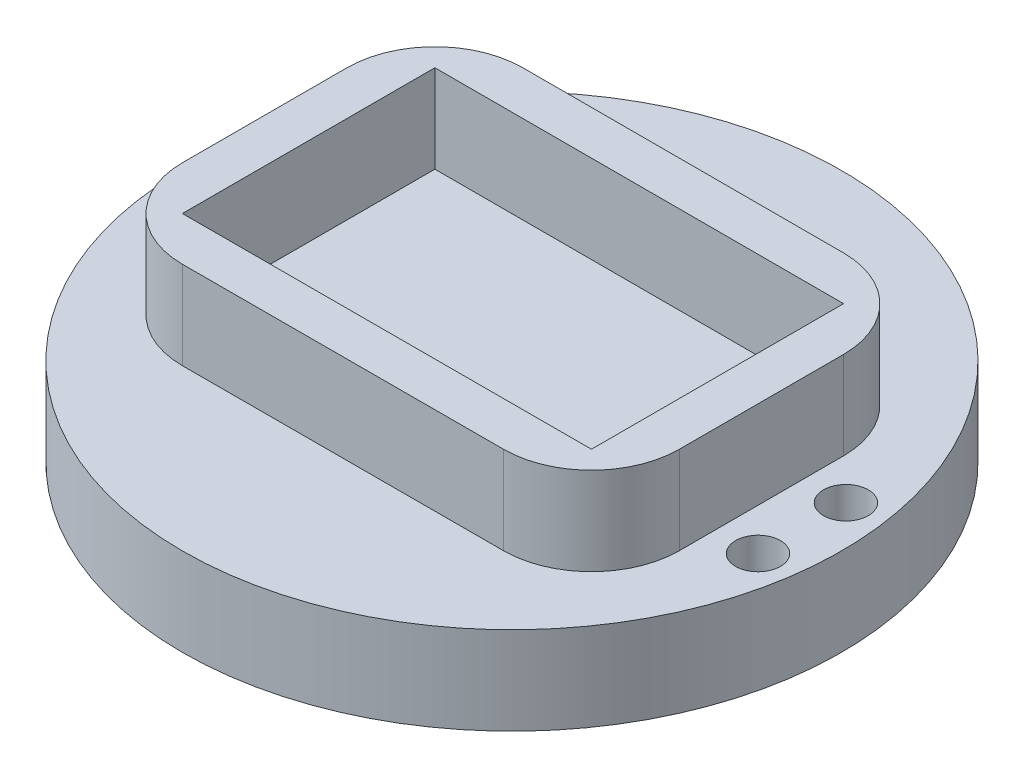
ISO-10303-21;
HEADER;
FILE_DESCRIPTION(('STEP AP214'),'2;1');
FILE_NAME('part.step','',(''),(''),'','','');
FILE_SCHEMA(('AUTOMOTIVE_DESIGN { 1 0 10303 214 1 1 1 1 }'));
ENDSEC;
DATA;
#1=APPLICATION_CONTEXT('core data for automotive mechanical design processes');
#2=APPLICATION_PROTOCOL_DEFINITION('international standard','automotive_design',2000,#1);
#3=PRODUCT_CONTEXT('',#1,'mechanical');
#4=PRODUCT('Part','Part','',(#3));
#5=PRODUCT_RELATED_PRODUCT_CATEGORY('part','',(#4));
#6=PRODUCT_DEFINITION_FORMATION('','',#4);
#7=PRODUCT_DEFINITION_CONTEXT('part definition',#1,'design');
#8=PRODUCT_DEFINITION('design','',#6,#7);
#9=PRODUCT_DEFINITION_SHAPE('','',#8);
#10=(LENGTH_UNIT() NAMED_UNIT(*) SI_UNIT(.MILLI.,.METRE.));
#11=(NAMED_UNIT(*) PLANE_ANGLE_UNIT() SI_UNIT($,.RADIAN.));
#12=(NAMED_UNIT(*) SI_UNIT($,.STERADIAN.) SOLID_ANGLE_UNIT());
#13=UNCERTAINTY_MEASURE_WITH_UNIT(LENGTH_MEASURE(1.E-05),#10,'distance_accuracy_value','');
#14=(GEOMETRIC_REPRESENTATION_CONTEXT(3) GLOBAL_UNCERTAINTY_ASSIGNED_CONTEXT((#13)) GLOBAL_UNIT_ASSIGNED_CONTEXT((#10,
#11,#12)) REPRESENTATION_CONTEXT('',''));
#15=CARTESIAN_POINT('',(0.,0.,0.));
#16=DIRECTION('',(0.,0.,1.));
#17=DIRECTION('',(1.,0.,0.));
#18=AXIS2_PLACEMENT_3D('',#15,#16,#17);
#19=CARTESIAN_POINT('',(11.9455168582029,10.,0.));
#20=DIRECTION('',(0.,-1.,0.));
#21=DIRECTION('',(0.,0.,-1.));
#22=AXIS2_PLACEMENT_3D('',#19,#20,#21);
#23=CYLINDRICAL_SURFACE('',#22,37.5);
#24=CARTESIAN_POINT('',(11.9455168582029,10.,0.));
#25=DIRECTION('',(0.,1.,0.));
#26=DIRECTION('',(0.,0.,1.));
#27=AXIS2_PLACEMENT_3D('',#24,#25,#26);
#28=CIRCLE('',#27,37.5);
#29=CARTESIAN_POINT('',(11.9455168582029,10.,37.5));
#30=VERTEX_POINT('',#29);
#31=EDGE_CURVE('E11',#30,#30,#28,.T.);
#32=ORIENTED_EDGE('',*,*,#31,.F.);
#33=EDGE_LOOP('',(#32));
#34=FACE_BOUND('',#33,.T.);
#35=CARTESIAN_POINT('',(11.9455168582029,0.,0.));
#36=DIRECTION('',(0.,1.,0.));
#37=DIRECTION('',(0.,0.,1.));
#38=AXIS2_PLACEMENT_3D('',#35,#36,#37);
#39=CIRCLE('',#38,37.5);
#40=CARTESIAN_POINT('',(11.9455168582029,0.,37.5));
#41=VERTEX_POINT('',#40);
#42=EDGE_CURVE('E48',#41,#41,#39,.T.);
#43=ORIENTED_EDGE('',*,*,#42,.T.);
#44=EDGE_LOOP('',(#43));
#45=FACE_BOUND('',#44,.T.);
#46=ADVANCED_FACE('F44',(#34,#45),#23,.T.);
#47=CARTESIAN_POINT('',(11.9455168582029,10.,0.));
#48=DIRECTION('',(0.,1.,0.));
#49=DIRECTION('',(0.,0.,1.));
#50=AXIS2_PLACEMENT_3D('',#47,#48,#49);
#51=PLANE('',#50);
#52=CARTESIAN_POINT('',(-21.0544831417971,10.,-5.));
#53=DIRECTION('',(0.,1.,0.));
#54=DIRECTION('',(0.,0.,-1.));
#55=AXIS2_PLACEMENT_3D('',#52,#53,#54);
#56=CIRCLE('',#55,2.55);
#57=CARTESIAN_POINT('',(-21.0544831417971,10.,-7.54999999999999));
#58=VERTEX_POINT('',#57);
#59=EDGE_CURVE('E488',#58,#58,#56,.T.);
#60=ORIENTED_EDGE('',*,*,#59,.F.);
#61=EDGE_LOOP('',(#60));
#62=FACE_BOUND('',#61,.T.);
#63=CARTESIAN_POINT('',(44.9455168582029,10.,5.));
#64=DIRECTION('',(0.,1.,0.));
#65=DIRECTION('',(0.,0.,-1.));
#66=AXIS2_PLACEMENT_3D('',#63,#64,#65);
#67=CIRCLE('',#66,2.55);
#68=CARTESIAN_POINT('',(44.9455168582029,10.,2.45000000000001));
#69=VERTEX_POINT('',#68);
#70=EDGE_CURVE('E494',#69,#69,#67,.T.);
#71=ORIENTED_EDGE('',*,*,#70,.F.);
#72=EDGE_LOOP('',(#71));
#73=FACE_BOUND('',#72,.T.);
#74=CARTESIAN_POINT('',(44.9455168582029,10.,-5.));
#75=DIRECTION('',(0.,1.,0.));
#76=DIRECTION('',(0.,0.,1.));
#77=AXIS2_PLACEMENT_3D('',#74,#75,#76);
#78=CIRCLE('',#77,2.55);
#79=CARTESIAN_POINT('',(44.9455168582029,10.,-2.45));
#80=VERTEX_POINT('',#79);
#81=EDGE_CURVE('E506',#80,#80,#78,.T.);
#82=ORIENTED_EDGE('',*,*,#81,.F.);
#83=EDGE_LOOP('',(#82));
#84=FACE_BOUND('',#83,.T.);
#85=CARTESIAN_POINT('',(-21.0544831417971,10.,5.));
#86=DIRECTION('',(0.,1.,0.));
#87=DIRECTION('',(0.,0.,1.));
#88=AXIS2_PLACEMENT_3D('',#85,#86,#87);
#89=CIRCLE('',#88,2.55);
#90=CARTESIAN_POINT('',(-21.0544831417971,10.,7.55));
#91=VERTEX_POINT('',#90);
#92=EDGE_CURVE('E489',#91,#91,#89,.T.);
#93=ORIENTED_EDGE('',*,*,#92,.F.);
#94=EDGE_LOOP('',(#93));
#95=FACE_BOUND('',#94,.T.);
#96=CARTESIAN_POINT('',(-6.30448314179638,10.,9.24462078190565));
#97=DIRECTION('',(0.,1.,0.));
#98=DIRECTION('',(0.,0.,-1.));
#99=AXIS2_PLACEMENT_3D('',#96,#97,#98);
#100=CIRCLE('',#99,10.);
#101=CARTESIAN_POINT('',(-16.3044831417964,10.,9.24462078190565));
#102=VERTEX_POINT('',#101);
#103=CARTESIAN_POINT('',(-6.29373046023773,10.,19.2446150008959));
#104=VERTEX_POINT('',#103);
#105=EDGE_CURVE('E58',#102,#104,#100,.T.);
#106=ORIENTED_EDGE('',*,*,#105,.F.);
#107=DIRECTION('',(0.,0.,1.));
#108=VECTOR('',#107,1.);
#109=CARTESIAN_POINT('',(-16.3044831417964,10.,-9.4843249413072));
#110=LINE('',#109,#108);
#111=CARTESIAN_POINT('',(-16.3044831417964,10.,-9.48432494130721));
#112=VERTEX_POINT('',#111);
#113=EDGE_CURVE('E63',#112,#102,#110,.T.);
#114=ORIENTED_EDGE('',*,*,#113,.F.);
#115=CARTESIAN_POINT('',(-6.30448314179639,10.,-9.4843249413072));
#116=DIRECTION('',(0.,1.,0.));
#117=DIRECTION('',(0.,0.,1.));
#118=AXIS2_PLACEMENT_3D('',#115,#116,#117);
#119=CIRCLE('',#118,10.);
#120=CARTESIAN_POINT('',(-6.30448314179639,10.,-19.4843249413072));
#121=VERTEX_POINT('',#120);
#122=EDGE_CURVE('E240',#121,#112,#119,.T.);
#123=ORIENTED_EDGE('',*,*,#122,.F.);
#124=DIRECTION('',(-1.,0.,0.));
#125=VECTOR('',#124,1.);
#126=CARTESIAN_POINT('',(-6.30448314179639,10.,-19.4843249413072));
#127=LINE('',#126,#125);
#128=CARTESIAN_POINT('',(30.1955168582024,10.,-19.4843249413072));
#129=VERTEX_POINT('',#128);
#130=EDGE_CURVE('E231',#129,#121,#127,.T.);
#131=ORIENTED_EDGE('',*,*,#130,.F.);
#132=CARTESIAN_POINT('',(30.1955168582024,10.,-9.4843249413072));
#133=DIRECTION('',(0.,1.,0.));
#134=DIRECTION('',(0.,0.,-1.));
#135=AXIS2_PLACEMENT_3D('',#132,#133,#134);
#136=CIRCLE('',#135,10.);
#137=CARTESIAN_POINT('',(40.1955168582024,10.,-9.4843249413072));
#138=VERTEX_POINT('',#137);
#139=EDGE_CURVE('E228',#138,#129,#136,.T.);
#140=ORIENTED_EDGE('',*,*,#139,.F.);
#141=DIRECTION('',(0.,0.,-1.));
#142=VECTOR('',#141,1.);
#143=CARTESIAN_POINT('',(40.1955168582024,10.,9.20537347152766));
#144=LINE('',#143,#142);
#145=CARTESIAN_POINT('',(40.1955168582024,10.,9.20537347152766));
#146=VERTEX_POINT('',#145);
#147=EDGE_CURVE('E223',#146,#138,#144,.T.);
#148=ORIENTED_EDGE('',*,*,#147,.F.);
#149=CARTESIAN_POINT('',(30.1955168582024,10.,9.20537347152766));
#150=DIRECTION('',(0.,1.,0.));
#151=DIRECTION('',(0.,0.,-1.));
#152=AXIS2_PLACEMENT_3D('',#149,#150,#151);
#153=CIRCLE('',#152,10.);
#154=CARTESIAN_POINT('',(30.206269539761,10.,19.205367690518));
#155=VERTEX_POINT('',#154);
#156=EDGE_CURVE('E222',#155,#146,#153,.T.);
#157=ORIENTED_EDGE('',*,*,#156,.F.);
#158=DIRECTION('',(0.999999421899029,0.,-0.001075268155865));
#159=VECTOR('',#158,1.);
#160=CARTESIAN_POINT('',(-6.29373046023773,10.,19.2446150008959));
#161=LINE('',#160,#159);
#162=EDGE_CURVE('E220',#104,#155,#161,.T.);
#163=ORIENTED_EDGE('',*,*,#162,.F.);
#164=EDGE_LOOP('',(#106,#114,#123,#131,#140,#148,#157,#163));
#165=FACE_BOUND('',#164,.T.);
#166=ORIENTED_EDGE('',*,*,#31,.T.);
#167=EDGE_LOOP('',(#166));
#168=FACE_BOUND('',#167,.T.);
#169=ADVANCED_FACE('F281',(#62,#73,#84,#95,#165,#168),#51,.T.);
#170=CARTESIAN_POINT('',(11.9455168582029,0.,0.));
#171=DIRECTION('',(0.,1.,0.));
#172=DIRECTION('',(0.,0.,1.));
#173=AXIS2_PLACEMENT_3D('',#170,#171,#172);
#174=PLANE('',#173);
#175=CARTESIAN_POINT('',(-21.0544831417971,0.,-5.));
#176=DIRECTION('',(0.,1.,0.));
#177=DIRECTION('',(0.,0.,-1.));
#178=AXIS2_PLACEMENT_3D('',#175,#176,#177);
#179=CIRCLE('',#178,2.55);
#180=CARTESIAN_POINT('',(-21.0544831417971,0.,-7.54999999999999));
#181=VERTEX_POINT('',#180);
#182=EDGE_CURVE('E484',#181,#181,#179,.T.);
#183=ORIENTED_EDGE('',*,*,#182,.T.);
#184=EDGE_LOOP('',(#183));
#185=FACE_BOUND('',#184,.T.);
#186=CARTESIAN_POINT('',(44.9455168582029,0.,5.));
#187=DIRECTION('',(0.,1.,0.));
#188=DIRECTION('',(0.,0.,-1.));
#189=AXIS2_PLACEMENT_3D('',#186,#187,#188);
#190=CIRCLE('',#189,2.55);
#191=CARTESIAN_POINT('',(44.9455168582029,0.,2.45000000000001));
#192=VERTEX_POINT('',#191);
#193=EDGE_CURVE('E503',#192,#192,#190,.T.);
#194=ORIENTED_EDGE('',*,*,#193,.T.);
#195=EDGE_LOOP('',(#194));
#196=FACE_BOUND('',#195,.T.);
#197=CARTESIAN_POINT('',(44.9455168582029,0.,-5.));
#198=DIRECTION('',(0.,1.,0.));
#199=DIRECTION('',(0.,0.,1.));
#200=AXIS2_PLACEMENT_3D('',#197,#198,#199);
#201=CIRCLE('',#200,2.55);
#202=CARTESIAN_POINT('',(44.9455168582029,0.,-2.45));
#203=VERTEX_POINT('',#202);
#204=EDGE_CURVE('E499',#203,#203,#201,.T.);
#205=ORIENTED_EDGE('',*,*,#204,.T.);
#206=EDGE_LOOP('',(#205));
#207=FACE_BOUND('',#206,.T.);
#208=CARTESIAN_POINT('',(-21.0544831417971,0.,5.));
#209=DIRECTION('',(0.,1.,0.));
#210=DIRECTION('',(0.,0.,1.));
#211=AXIS2_PLACEMENT_3D('',#208,#209,#210);
#212=CIRCLE('',#211,2.55);
#213=CARTESIAN_POINT('',(-21.0544831417971,0.,7.55));
#214=VERTEX_POINT('',#213);
#215=EDGE_CURVE('E171',#214,#214,#212,.T.);
#216=ORIENTED_EDGE('',*,*,#215,.T.);
#217=EDGE_LOOP('',(#216));
#218=FACE_BOUND('',#217,.T.);
#219=ORIENTED_EDGE('',*,*,#42,.F.);
#220=EDGE_LOOP('',(#219));
#221=FACE_BOUND('',#220,.T.);
#222=ADVANCED_FACE('F276',(#185,#196,#207,#218,#221),#174,.F.);
#223=CARTESIAN_POINT('',(-6.30448314179638,20.,9.24462078190565));
#224=DIRECTION('',(0.,-1.,0.));
#225=DIRECTION('',(0.,0.,-1.));
#226=AXIS2_PLACEMENT_3D('',#223,#224,#225);
#227=PLANE('',#226);
#228=CARTESIAN_POINT('',(-6.30448314179638,20.,9.24462078190565));
#229=DIRECTION('',(0.,1.,0.));
#230=DIRECTION('',(0.,0.,-1.));
#231=AXIS2_PLACEMENT_3D('',#228,#229,#230);
#232=CIRCLE('',#231,10.);
#233=CARTESIAN_POINT('',(-16.3044831417964,20.,9.24462078190565));
#234=VERTEX_POINT('',#233);
#235=CARTESIAN_POINT('',(-6.29373046023773,20.,19.2446150008959));
#236=VERTEX_POINT('',#235);
#237=EDGE_CURVE('E188',#234,#236,#232,.T.);
#238=ORIENTED_EDGE('',*,*,#237,.T.);
#239=DIRECTION('',(0.999999421899029,0.,-0.001075268155865));
#240=VECTOR('',#239,1.);
#241=CARTESIAN_POINT('',(-6.29373046023773,20.,19.2446150008959));
#242=LINE('',#241,#240);
#243=CARTESIAN_POINT('',(30.206269539761,20.,19.205367690518));
#244=VERTEX_POINT('',#243);
#245=EDGE_CURVE('E191',#236,#244,#242,.T.);
#246=ORIENTED_EDGE('',*,*,#245,.T.);
#247=CARTESIAN_POINT('',(30.1955168582024,20.,9.20537347152766));
#248=DIRECTION('',(0.,1.,0.));
#249=DIRECTION('',(0.,0.,-1.));
#250=AXIS2_PLACEMENT_3D('',#247,#248,#249);
#251=CIRCLE('',#250,10.);
#252=CARTESIAN_POINT('',(40.1955168582024,20.,9.20537347152766));
#253=VERTEX_POINT('',#252);
#254=EDGE_CURVE('E198',#244,#253,#251,.T.);
#255=ORIENTED_EDGE('',*,*,#254,.T.);
#256=DIRECTION('',(0.,0.,-1.));
#257=VECTOR('',#256,1.);
#258=CARTESIAN_POINT('',(40.1955168582024,20.,9.20537347152766));
#259=LINE('',#258,#257);
#260=CARTESIAN_POINT('',(40.1955168582024,20.,-9.4843249413072));
#261=VERTEX_POINT('',#260);
#262=EDGE_CURVE('E200',#253,#261,#259,.T.);
#263=ORIENTED_EDGE('',*,*,#262,.T.);
#264=CARTESIAN_POINT('',(30.1955168582024,20.,-9.4843249413072));
#265=DIRECTION('',(0.,1.,0.));
#266=DIRECTION('',(0.,0.,-1.));
#267=AXIS2_PLACEMENT_3D('',#264,#265,#266);
#268=CIRCLE('',#267,10.);
#269=CARTESIAN_POINT('',(30.1955168582024,20.,-19.4843249413072));
#270=VERTEX_POINT('',#269);
#271=EDGE_CURVE('E205',#261,#270,#268,.T.);
#272=ORIENTED_EDGE('',*,*,#271,.T.);
#273=DIRECTION('',(-1.,0.,0.));
#274=VECTOR('',#273,1.);
#275=CARTESIAN_POINT('',(-6.30448314179639,20.,-19.4843249413072));
#276=LINE('',#275,#274);
#277=CARTESIAN_POINT('',(-6.30448314179639,20.,-19.4843249413072));
#278=VERTEX_POINT('',#277);
#279=EDGE_CURVE('E202',#270,#278,#276,.T.);
#280=ORIENTED_EDGE('',*,*,#279,.T.);
#281=CARTESIAN_POINT('',(-6.30448314179639,20.,-9.4843249413072));
#282=DIRECTION('',(0.,1.,0.));
#283=DIRECTION('',(0.,0.,1.));
#284=AXIS2_PLACEMENT_3D('',#281,#282,#283);
#285=CIRCLE('',#284,10.);
#286=CARTESIAN_POINT('',(-16.3044831417964,20.,-9.48432494130721));
#287=VERTEX_POINT('',#286);
#288=EDGE_CURVE('E208',#278,#287,#285,.T.);
#289=ORIENTED_EDGE('',*,*,#288,.T.);
#290=DIRECTION('',(0.,0.,1.));
#291=VECTOR('',#290,1.);
#292=CARTESIAN_POINT('',(-16.3044831417964,20.,-9.4843249413072));
#293=LINE('',#292,#291);
#294=EDGE_CURVE('E211',#287,#234,#293,.T.);
#295=ORIENTED_EDGE('',*,*,#294,.T.);
#296=EDGE_LOOP('',(#238,#246,#255,#263,#272,#280,#289,#295));
#297=FACE_BOUND('',#296,.T.);
#298=DIRECTION('',(-1.,0.,0.));
#299=VECTOR('',#298,1.);
#300=CARTESIAN_POINT('',(-11.3044831417964,20.,-14.4843249413072));
#301=LINE('',#300,#299);
#302=CARTESIAN_POINT('',(35.1955168582024,20.,-14.4843249413072));
#303=VERTEX_POINT('',#302);
#304=CARTESIAN_POINT('',(-11.3044831417964,20.,-14.4843249413072));
#305=VERTEX_POINT('',#304);
#306=EDGE_CURVE('E134',#303,#305,#301,.T.);
#307=ORIENTED_EDGE('',*,*,#306,.F.);
#308=DIRECTION('',(0.,0.,-1.));
#309=VECTOR('',#308,1.);
#310=CARTESIAN_POINT('',(35.1955168582024,20.,14.2000000181468));
#311=LINE('',#310,#309);
#312=CARTESIAN_POINT('',(35.1955168582024,20.,14.2000000181468));
#313=VERTEX_POINT('',#312);
#314=EDGE_CURVE('E165',#313,#303,#311,.T.);
#315=ORIENTED_EDGE('',*,*,#314,.F.);
#316=DIRECTION('',(0.999999421899029,0.,-0.00107526815586512));
#317=VECTOR('',#316,1.);
#318=CARTESIAN_POINT('',(-11.3044831417964,20.,14.2500000162996));
#319=LINE('',#318,#317);
#320=CARTESIAN_POINT('',(-11.3044831417964,20.,14.2500000162996));
#321=VERTEX_POINT('',#320);
#322=EDGE_CURVE('E158',#321,#313,#319,.T.);
#323=ORIENTED_EDGE('',*,*,#322,.F.);
#324=DIRECTION('',(0.,0.,1.));
#325=VECTOR('',#324,1.);
#326=CARTESIAN_POINT('',(-11.3044831417964,20.,-14.4843249413072));
#327=LINE('',#326,#325);
#328=EDGE_CURVE('E145',#305,#321,#327,.T.);
#329=ORIENTED_EDGE('',*,*,#328,.F.);
#330=EDGE_LOOP('',(#307,#315,#323,#329));
#331=FACE_BOUND('',#330,.T.);
#332=ADVANCED_FACE('F156',(#297,#331),#227,.F.);
#333=CARTESIAN_POINT('',(-6.30448314179638,20.,9.24462078190565));
#334=DIRECTION('',(0.,-1.,0.));
#335=DIRECTION('',(0.,0.,-1.));
#336=AXIS2_PLACEMENT_3D('',#333,#334,#335);
#337=CYLINDRICAL_SURFACE('',#336,10.);
#338=ORIENTED_EDGE('',*,*,#105,.T.);
#339=DIRECTION('',(0.,-1.,0.));
#340=VECTOR('',#339,1.);
#341=CARTESIAN_POINT('',(-6.29373046023773,20.,19.2446150008959));
#342=LINE('',#341,#340);
#343=EDGE_CURVE('E267',#236,#104,#342,.T.);
#344=ORIENTED_EDGE('',*,*,#343,.F.);
#345=ORIENTED_EDGE('',*,*,#237,.F.);
#346=DIRECTION('',(0.,-1.,0.));
#347=VECTOR('',#346,1.);
#348=CARTESIAN_POINT('',(-16.3044831417964,20.,9.24462078190565));
#349=LINE('',#348,#347);
#350=EDGE_CURVE('E212',#234,#102,#349,.T.);
#351=ORIENTED_EDGE('',*,*,#350,.T.);
#352=EDGE_LOOP('',(#338,#344,#345,#351));
#353=FACE_BOUND('',#352,.T.);
#354=ADVANCED_FACE('F286',(#353),#337,.T.);
#355=CARTESIAN_POINT('',(-6.29373046023773,20.,19.2446150008959));
#356=DIRECTION('',(-0.001075268155865,0.,-0.999999421899029));
#357=DIRECTION('',(-0.999999421899029,0.,0.001075268155865));
#358=AXIS2_PLACEMENT_3D('',#355,#356,#357);
#359=PLANE('',#358);
#360=ORIENTED_EDGE('',*,*,#162,.T.);
#361=DIRECTION('',(0.,-1.,0.));
#362=VECTOR('',#361,1.);
#363=CARTESIAN_POINT('',(30.206269539761,20.,19.205367690518));
#364=LINE('',#363,#362);
#365=EDGE_CURVE('E264',#244,#155,#364,.T.);
#366=ORIENTED_EDGE('',*,*,#365,.F.);
#367=ORIENTED_EDGE('',*,*,#245,.F.);
#368=ORIENTED_EDGE('',*,*,#343,.T.);
#369=EDGE_LOOP('',(#360,#366,#367,#368));
#370=FACE_BOUND('',#369,.T.);
#371=ADVANCED_FACE('F316',(#370),#359,.F.);
#372=CARTESIAN_POINT('',(30.1955168582024,20.,9.20537347152766));
#373=DIRECTION('',(0.,-1.,0.));
#374=DIRECTION('',(0.,0.,-1.));
#375=AXIS2_PLACEMENT_3D('',#372,#373,#374);
#376=CYLINDRICAL_SURFACE('',#375,10.);
#377=ORIENTED_EDGE('',*,*,#156,.T.);
#378=DIRECTION('',(0.,-1.,0.));
#379=VECTOR('',#378,1.);
#380=CARTESIAN_POINT('',(40.1955168582024,20.,9.20537347152766));
#381=LINE('',#380,#379);
#382=EDGE_CURVE('E261',#253,#146,#381,.T.);
#383=ORIENTED_EDGE('',*,*,#382,.F.);
#384=ORIENTED_EDGE('',*,*,#254,.F.);
#385=ORIENTED_EDGE('',*,*,#365,.T.);
#386=EDGE_LOOP('',(#377,#383,#384,#385));
#387=FACE_BOUND('',#386,.T.);
#388=ADVANCED_FACE('F324',(#387),#376,.T.);
#389=CARTESIAN_POINT('',(40.1955168582024,20.,9.20537347152766));
#390=DIRECTION('',(-1.,0.,0.));
#391=DIRECTION('',(0.,0.,1.));
#392=AXIS2_PLACEMENT_3D('',#389,#390,#391);
#393=PLANE('',#392);
#394=ORIENTED_EDGE('',*,*,#147,.T.);
#395=DIRECTION('',(0.,-1.,0.));
#396=VECTOR('',#395,1.);
#397=CARTESIAN_POINT('',(40.1955168582024,20.,-9.4843249413072));
#398=LINE('',#397,#396);
#399=EDGE_CURVE('E260',#261,#138,#398,.T.);
#400=ORIENTED_EDGE('',*,*,#399,.F.);
#401=ORIENTED_EDGE('',*,*,#262,.F.);
#402=ORIENTED_EDGE('',*,*,#382,.T.);
#403=EDGE_LOOP('',(#394,#400,#401,#402));
#404=FACE_BOUND('',#403,.T.);
#405=ADVANCED_FACE('F334',(#404),#393,.F.);
#406=CARTESIAN_POINT('',(30.1955168582024,20.,-9.4843249413072));
#407=DIRECTION('',(0.,-1.,0.));
#408=DIRECTION('',(0.,0.,-1.));
#409=AXIS2_PLACEMENT_3D('',#406,#407,#408);
#410=CYLINDRICAL_SURFACE('',#409,10.);
#411=ORIENTED_EDGE('',*,*,#139,.T.);
#412=DIRECTION('',(0.,-1.,0.));
#413=VECTOR('',#412,1.);
#414=CARTESIAN_POINT('',(30.1955168582024,20.,-19.4843249413072));
#415=LINE('',#414,#413);
#416=EDGE_CURVE('E251',#270,#129,#415,.T.);
#417=ORIENTED_EDGE('',*,*,#416,.F.);
#418=ORIENTED_EDGE('',*,*,#271,.F.);
#419=ORIENTED_EDGE('',*,*,#399,.T.);
#420=EDGE_LOOP('',(#411,#417,#418,#419));
#421=FACE_BOUND('',#420,.T.);
#422=ADVANCED_FACE('F345',(#421),#410,.T.);
#423=CARTESIAN_POINT('',(-6.30448314179639,20.,-19.4843249413072));
#424=DIRECTION('',(0.,0.,1.));
#425=DIRECTION('',(1.,0.,0.));
#426=AXIS2_PLACEMENT_3D('',#423,#424,#425);
#427=PLANE('',#426);
#428=ORIENTED_EDGE('',*,*,#130,.T.);
#429=DIRECTION('',(0.,-1.,0.));
#430=VECTOR('',#429,1.);
#431=CARTESIAN_POINT('',(-6.30448314179639,20.,-19.4843249413072));
#432=LINE('',#431,#430);
#433=EDGE_CURVE('E249',#278,#121,#432,.T.);
#434=ORIENTED_EDGE('',*,*,#433,.F.);
#435=ORIENTED_EDGE('',*,*,#279,.F.);
#436=ORIENTED_EDGE('',*,*,#416,.T.);
#437=EDGE_LOOP('',(#428,#434,#435,#436));
#438=FACE_BOUND('',#437,.T.);
#439=ADVANCED_FACE('F351',(#438),#427,.F.);
#440=CARTESIAN_POINT('',(-6.30448314179639,20.,-9.4843249413072));
#441=DIRECTION('',(0.,-1.,0.));
#442=DIRECTION('',(0.,0.,-1.));
#443=AXIS2_PLACEMENT_3D('',#440,#441,#442);
#444=CYLINDRICAL_SURFACE('',#443,10.);
#445=ORIENTED_EDGE('',*,*,#122,.T.);
#446=DIRECTION('',(0.,-1.,0.));
#447=VECTOR('',#446,1.);
#448=CARTESIAN_POINT('',(-16.3044831417964,20.,-9.48432494130721));
#449=LINE('',#448,#447);
#450=EDGE_CURVE('E245',#287,#112,#449,.T.);
#451=ORIENTED_EDGE('',*,*,#450,.F.);
#452=ORIENTED_EDGE('',*,*,#288,.F.);
#453=ORIENTED_EDGE('',*,*,#433,.T.);
#454=EDGE_LOOP('',(#445,#451,#452,#453));
#455=FACE_BOUND('',#454,.T.);
#456=ADVANCED_FACE('F357',(#455),#444,.T.);
#457=CARTESIAN_POINT('',(-16.3044831417964,20.,-9.4843249413072));
#458=DIRECTION('',(1.,0.,0.));
#459=DIRECTION('',(0.,0.,-1.));
#460=AXIS2_PLACEMENT_3D('',#457,#458,#459);
#461=PLANE('',#460);
#462=ORIENTED_EDGE('',*,*,#113,.T.);
#463=ORIENTED_EDGE('',*,*,#350,.F.);
#464=ORIENTED_EDGE('',*,*,#294,.F.);
#465=ORIENTED_EDGE('',*,*,#450,.T.);
#466=EDGE_LOOP('',(#462,#463,#464,#465));
#467=FACE_BOUND('',#466,.T.);
#468=ADVANCED_FACE('F369',(#467),#461,.F.);
#469=CARTESIAN_POINT('',(-11.3044831417964,20.,-14.4843249413072));
#470=DIRECTION('',(0.,0.,1.));
#471=DIRECTION('',(1.,0.,0.));
#472=AXIS2_PLACEMENT_3D('',#469,#470,#471);
#473=PLANE('',#472);
#474=DIRECTION('',(-1.,0.,0.));
#475=VECTOR('',#474,1.);
#476=CARTESIAN_POINT('',(-11.3044831417964,10.,-14.4843249413072));
#477=LINE('',#476,#475);
#478=CARTESIAN_POINT('',(35.1955168582024,10.,-14.4843249413072));
#479=VERTEX_POINT('',#478);
#480=CARTESIAN_POINT('',(-11.3044831417964,10.,-14.4843249413072));
#481=VERTEX_POINT('',#480);
#482=EDGE_CURVE('E169',#479,#481,#477,.T.);
#483=ORIENTED_EDGE('',*,*,#482,.F.);
#484=DIRECTION('',(0.,-1.,0.));
#485=VECTOR('',#484,1.);
#486=CARTESIAN_POINT('',(35.1955168582024,20.,-14.4843249413072));
#487=LINE('',#486,#485);
#488=EDGE_CURVE('E139',#303,#479,#487,.T.);
#489=ORIENTED_EDGE('',*,*,#488,.F.);
#490=ORIENTED_EDGE('',*,*,#306,.T.);
#491=DIRECTION('',(0.,-1.,0.));
#492=VECTOR('',#491,1.);
#493=CARTESIAN_POINT('',(-11.3044831417964,20.,-14.4843249413072));
#494=LINE('',#493,#492);
#495=EDGE_CURVE('E138',#305,#481,#494,.T.);
#496=ORIENTED_EDGE('',*,*,#495,.T.);
#497=EDGE_LOOP('',(#483,#489,#490,#496));
#498=FACE_BOUND('',#497,.T.);
#499=ADVANCED_FACE('F135',(#498),#473,.T.);
#500=CARTESIAN_POINT('',(-11.3044831417964,20.,-14.4843249413072));
#501=DIRECTION('',(1.,0.,0.));
#502=DIRECTION('',(0.,0.,-1.));
#503=AXIS2_PLACEMENT_3D('',#500,#501,#502);
#504=PLANE('',#503);
#505=DIRECTION('',(0.,0.,1.));
#506=VECTOR('',#505,1.);
#507=CARTESIAN_POINT('',(-11.3044831417964,10.,-14.4843249413072));
#508=LINE('',#507,#506);
#509=CARTESIAN_POINT('',(-11.3044831417964,10.,14.2500000162996));
#510=VERTEX_POINT('',#509);
#511=EDGE_CURVE('E151',#481,#510,#508,.T.);
#512=ORIENTED_EDGE('',*,*,#511,.F.);
#513=ORIENTED_EDGE('',*,*,#495,.F.);
#514=ORIENTED_EDGE('',*,*,#328,.T.);
#515=DIRECTION('',(0.,-1.,0.));
#516=VECTOR('',#515,1.);
#517=CARTESIAN_POINT('',(-11.3044831417964,20.,14.2500000162996));
#518=LINE('',#517,#516);
#519=EDGE_CURVE('E153',#321,#510,#518,.T.);
#520=ORIENTED_EDGE('',*,*,#519,.T.);
#521=EDGE_LOOP('',(#512,#513,#514,#520));
#522=FACE_BOUND('',#521,.T.);
#523=ADVANCED_FACE('F146',(#522),#504,.T.);
#524=CARTESIAN_POINT('',(-11.3044831417964,20.,14.2500000162996));
#525=DIRECTION('',(-0.00107526815586512,0.,-0.999999421899029));
#526=DIRECTION('',(-0.999999421899029,0.,0.00107526815586512));
#527=AXIS2_PLACEMENT_3D('',#524,#525,#526);
#528=PLANE('',#527);
#529=DIRECTION('',(0.999999421899029,0.,-0.00107526815586512));
#530=VECTOR('',#529,1.);
#531=CARTESIAN_POINT('',(-11.3044831417964,10.,14.2500000162996));
#532=LINE('',#531,#530);
#533=CARTESIAN_POINT('',(35.1955168582024,10.,14.2000000181468));
#534=VERTEX_POINT('',#533);
#535=EDGE_CURVE('E173',#510,#534,#532,.T.);
#536=ORIENTED_EDGE('',*,*,#535,.F.);
#537=ORIENTED_EDGE('',*,*,#519,.F.);
#538=ORIENTED_EDGE('',*,*,#322,.T.);
#539=DIRECTION('',(0.,-1.,0.));
#540=VECTOR('',#539,1.);
#541=CARTESIAN_POINT('',(35.1955168582024,20.,14.2000000181468));
#542=LINE('',#541,#540);
#543=EDGE_CURVE('E181',#313,#534,#542,.T.);
#544=ORIENTED_EDGE('',*,*,#543,.T.);
#545=EDGE_LOOP('',(#536,#537,#538,#544));
#546=FACE_BOUND('',#545,.T.);
#547=ADVANCED_FACE('F394',(#546),#528,.T.);
#548=CARTESIAN_POINT('',(35.1955168582024,20.,14.2000000181468));
#549=DIRECTION('',(-1.,0.,0.));
#550=DIRECTION('',(0.,0.,1.));
#551=AXIS2_PLACEMENT_3D('',#548,#549,#550);
#552=PLANE('',#551);
#553=DIRECTION('',(0.,0.,-1.));
#554=VECTOR('',#553,1.);
#555=CARTESIAN_POINT('',(35.1955168582024,10.,14.2000000181468));
#556=LINE('',#555,#554);
#557=EDGE_CURVE('E144',#534,#479,#556,.T.);
#558=ORIENTED_EDGE('',*,*,#557,.F.);
#559=ORIENTED_EDGE('',*,*,#543,.F.);
#560=ORIENTED_EDGE('',*,*,#314,.T.);
#561=ORIENTED_EDGE('',*,*,#488,.T.);
#562=EDGE_LOOP('',(#558,#559,#560,#561));
#563=FACE_BOUND('',#562,.T.);
#564=ADVANCED_FACE('F402',(#563),#552,.T.);
#565=ORIENTED_EDGE('',*,*,#535,.T.);
#566=ORIENTED_EDGE('',*,*,#557,.T.);
#567=ORIENTED_EDGE('',*,*,#482,.T.);
#568=ORIENTED_EDGE('',*,*,#511,.T.);
#569=EDGE_LOOP('',(#565,#566,#567,#568));
#570=FACE_BOUND('',#569,.T.);
#571=ADVANCED_FACE('F291',(#570),#51,.T.);
#572=CARTESIAN_POINT('',(-21.0544831417971,0.,5.));
#573=DIRECTION('',(0.,1.,0.));
#574=DIRECTION('',(0.,0.,1.));
#575=AXIS2_PLACEMENT_3D('',#572,#573,#574);
#576=CYLINDRICAL_SURFACE('',#575,2.55);
#577=ORIENTED_EDGE('',*,*,#215,.F.);
#578=EDGE_LOOP('',(#577));
#579=FACE_BOUND('',#578,.T.);
#580=ORIENTED_EDGE('',*,*,#92,.T.);
#581=EDGE_LOOP('',(#580));
#582=FACE_BOUND('',#581,.T.);
#583=ADVANCED_FACE('F416',(#579,#582),#576,.F.);
#584=CARTESIAN_POINT('',(44.9455168582029,0.,-5.));
#585=DIRECTION('',(0.,1.,0.));
#586=DIRECTION('',(0.,0.,1.));
#587=AXIS2_PLACEMENT_3D('',#584,#585,#586);
#588=CYLINDRICAL_SURFACE('',#587,2.55);
#589=ORIENTED_EDGE('',*,*,#204,.F.);
#590=EDGE_LOOP('',(#589));
#591=FACE_BOUND('',#590,.T.);
#592=ORIENTED_EDGE('',*,*,#81,.T.);
#593=EDGE_LOOP('',(#592));
#594=FACE_BOUND('',#593,.T.);
#595=ADVANCED_FACE('F448',(#591,#594),#588,.F.);
#596=CARTESIAN_POINT('',(44.9455168582029,0.,5.));
#597=DIRECTION('',(0.,1.,0.));
#598=DIRECTION('',(0.,0.,1.));
#599=AXIS2_PLACEMENT_3D('',#596,#597,#598);
#600=CYLINDRICAL_SURFACE('',#599,2.55);
#601=ORIENTED_EDGE('',*,*,#193,.F.);
#602=EDGE_LOOP('',(#601));
#603=FACE_BOUND('',#602,.T.);
#604=ORIENTED_EDGE('',*,*,#70,.T.);
#605=EDGE_LOOP('',(#604));
#606=FACE_BOUND('',#605,.T.);
#607=ADVANCED_FACE('F456',(#603,#606),#600,.F.);
#608=CARTESIAN_POINT('',(-21.0544831417971,0.,-5.));
#609=DIRECTION('',(0.,1.,0.));
#610=DIRECTION('',(0.,0.,1.));
#611=AXIS2_PLACEMENT_3D('',#608,#609,#610);
#612=CYLINDRICAL_SURFACE('',#611,2.55);
#613=ORIENTED_EDGE('',*,*,#182,.F.);
#614=EDGE_LOOP('',(#613));
#615=FACE_BOUND('',#614,.T.);
#616=ORIENTED_EDGE('',*,*,#59,.T.);
#617=EDGE_LOOP('',(#616));
#618=FACE_BOUND('',#617,.T.);
#619=ADVANCED_FACE('F470',(#615,#618),#612,.F.);
#620=CLOSED_SHELL('',(#46,#169,#222,#332,#354,#371,#388,#405,#422,#439,#456,#468,#499,#523,#547,
#564,#571,#583,#595,#607,#619));
#621=MANIFOLD_SOLID_BREP('B2',#620);
#622=ADVANCED_BREP_SHAPE_REPRESENTATION('',(#18,#621),#14);
#623=SHAPE_DEFINITION_REPRESENTATION(#9,#622);
ENDSEC;
END-ISO-10303-21;
